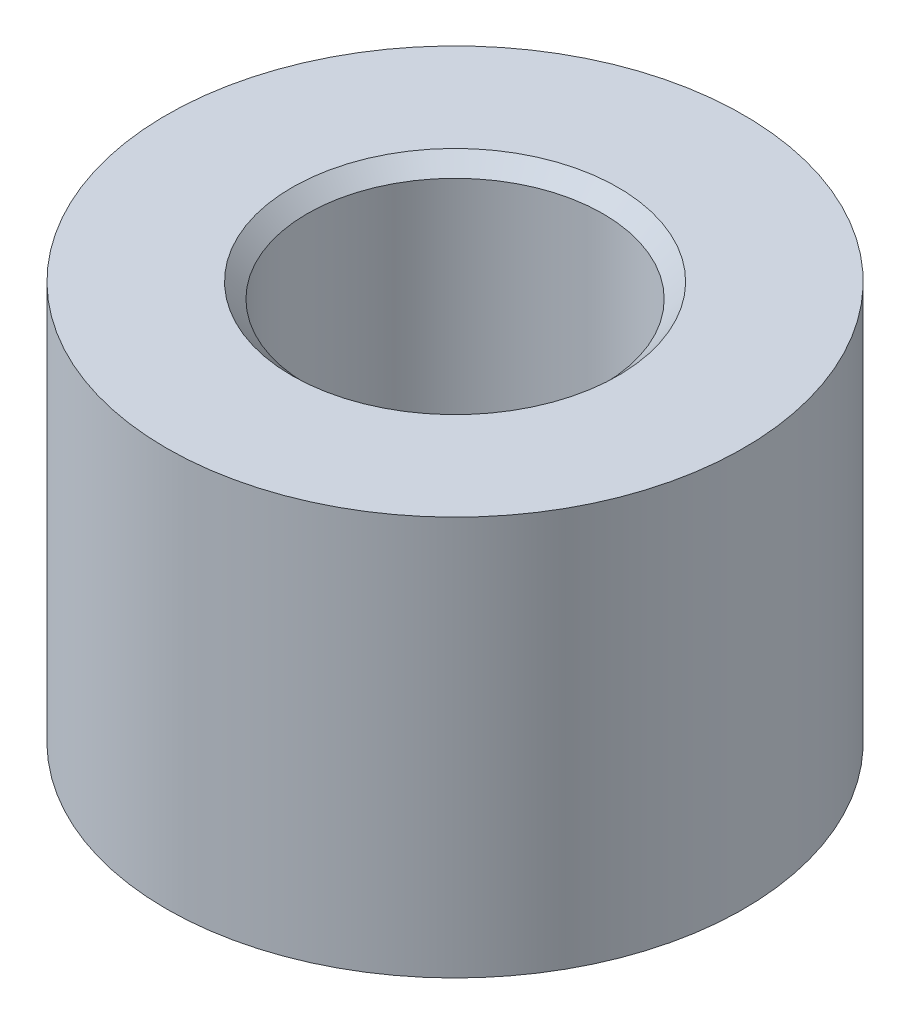
ISO-10303-21;
HEADER;
FILE_DESCRIPTION(('STEP AP214'),'2;1');
FILE_NAME('part.step','',(''),(''),'','','');
FILE_SCHEMA(('AUTOMOTIVE_DESIGN { 1 0 10303 214 1 1 1 1 }'));
ENDSEC;
DATA;
#1=APPLICATION_CONTEXT('core data for automotive mechanical design processes');
#2=APPLICATION_PROTOCOL_DEFINITION('international standard','automotive_design',2000,#1);
#3=PRODUCT_CONTEXT('',#1,'mechanical');
#4=PRODUCT('Part','Part','',(#3));
#5=PRODUCT_RELATED_PRODUCT_CATEGORY('part','',(#4));
#6=PRODUCT_DEFINITION_FORMATION('','',#4);
#7=PRODUCT_DEFINITION_CONTEXT('part definition',#1,'design');
#8=PRODUCT_DEFINITION('design','',#6,#7);
#9=PRODUCT_DEFINITION_SHAPE('','',#8);
#10=(LENGTH_UNIT() NAMED_UNIT(*) SI_UNIT(.MILLI.,.METRE.));
#11=(NAMED_UNIT(*) PLANE_ANGLE_UNIT() SI_UNIT($,.RADIAN.));
#12=(NAMED_UNIT(*) SI_UNIT($,.STERADIAN.) SOLID_ANGLE_UNIT());
#13=UNCERTAINTY_MEASURE_WITH_UNIT(LENGTH_MEASURE(1.E-05),#10,'distance_accuracy_value','');
#14=(GEOMETRIC_REPRESENTATION_CONTEXT(3) GLOBAL_UNCERTAINTY_ASSIGNED_CONTEXT((#13)) GLOBAL_UNIT_ASSIGNED_CONTEXT((#10,
#11,#12)) REPRESENTATION_CONTEXT('',''));
#15=CARTESIAN_POINT('',(0.,0.,0.));
#16=DIRECTION('',(0.,0.,1.));
#17=DIRECTION('',(1.,0.,0.));
#18=AXIS2_PLACEMENT_3D('',#15,#16,#17);
#19=CARTESIAN_POINT('',(0.,5.2690014,0.));
#20=DIRECTION('',(0.,1.,0.));
#21=DIRECTION('',(0.,0.,1.));
#22=AXIS2_PLACEMENT_3D('',#19,#20,#21);
#23=PLANE('',#22);
#24=CARTESIAN_POINT('',(0.,5.2690014,0.));
#25=DIRECTION('',(0.,1.,0.));
#26=DIRECTION('',(0.,0.,1.));
#27=AXIS2_PLACEMENT_3D('',#24,#25,#26);
#28=CIRCLE('',#27,2.1526);
#29=CARTESIAN_POINT('',(0.,5.2690014,2.1526));
#30=VERTEX_POINT('',#29);
#31=EDGE_CURVE('E10',#30,#30,#28,.F.);
#32=ORIENTED_EDGE('',*,*,#31,.T.);
#33=EDGE_LOOP('',(#32));
#34=FACE_BOUND('',#33,.T.);
#35=CARTESIAN_POINT('',(0.,5.2690014,0.));
#36=DIRECTION('',(0.,1.,0.));
#37=DIRECTION('',(0.,0.,1.));
#38=AXIS2_PLACEMENT_3D('',#35,#36,#37);
#39=CIRCLE('',#38,3.81);
#40=CARTESIAN_POINT('',(0.,5.2690014,3.81));
#41=VERTEX_POINT('',#40);
#42=EDGE_CURVE('E51',#41,#41,#39,.T.);
#43=ORIENTED_EDGE('',*,*,#42,.T.);
#44=EDGE_LOOP('',(#43));
#45=FACE_BOUND('',#44,.T.);
#46=ADVANCED_FACE('F31',(#34,#45),#23,.T.);
#47=CARTESIAN_POINT('',(0.,0.,0.));
#48=DIRECTION('',(0.,1.,0.));
#49=DIRECTION('',(0.,0.,1.));
#50=AXIS2_PLACEMENT_3D('',#47,#48,#49);
#51=PLANE('',#50);
#52=CARTESIAN_POINT('',(0.,0.,0.));
#53=DIRECTION('',(0.,1.,0.));
#54=DIRECTION('',(0.,0.,1.));
#55=AXIS2_PLACEMENT_3D('',#52,#53,#54);
#56=CIRCLE('',#55,2.1526);
#57=CARTESIAN_POINT('',(0.,0.,2.1526));
#58=VERTEX_POINT('',#57);
#59=EDGE_CURVE('E46',#58,#58,#56,.T.);
#60=ORIENTED_EDGE('',*,*,#59,.T.);
#61=EDGE_LOOP('',(#60));
#62=FACE_BOUND('',#61,.T.);
#63=CARTESIAN_POINT('',(0.,0.,0.));
#64=DIRECTION('',(0.,1.,0.));
#65=DIRECTION('',(0.,0.,1.));
#66=AXIS2_PLACEMENT_3D('',#63,#64,#65);
#67=CIRCLE('',#66,3.81);
#68=CARTESIAN_POINT('',(0.,0.,3.81));
#69=VERTEX_POINT('',#68);
#70=EDGE_CURVE('E52',#69,#69,#67,.T.);
#71=ORIENTED_EDGE('',*,*,#70,.F.);
#72=EDGE_LOOP('',(#71));
#73=FACE_BOUND('',#72,.T.);
#74=ADVANCED_FACE('F63',(#62,#73),#51,.F.);
#75=CARTESIAN_POINT('',(0.,5.2690014,0.));
#76=DIRECTION('',(0.,-1.,0.));
#77=DIRECTION('',(0.,0.,-1.));
#78=AXIS2_PLACEMENT_3D('',#75,#76,#77);
#79=CYLINDRICAL_SURFACE('',#78,3.81);
#80=ORIENTED_EDGE('',*,*,#42,.F.);
#81=EDGE_LOOP('',(#80));
#82=FACE_BOUND('',#81,.T.);
#83=ORIENTED_EDGE('',*,*,#70,.T.);
#84=EDGE_LOOP('',(#83));
#85=FACE_BOUND('',#84,.T.);
#86=ADVANCED_FACE('F59',(#82,#85),#79,.T.);
#87=CARTESIAN_POINT('',(0.,5.2690014,0.));
#88=DIRECTION('',(0.,-1.,0.));
#89=DIRECTION('',(0.,0.,-1.));
#90=AXIS2_PLACEMENT_3D('',#87,#88,#89);
#91=CYLINDRICAL_SURFACE('',#90,1.9526);
#92=CARTESIAN_POINT('',(0.,0.200000000000001,0.));
#93=DIRECTION('',(0.,1.,0.));
#94=DIRECTION('',(0.,0.,1.));
#95=AXIS2_PLACEMENT_3D('',#92,#93,#94);
#96=CIRCLE('',#95,1.9526);
#97=CARTESIAN_POINT('',(0.,0.200000000000001,1.9526));
#98=VERTEX_POINT('',#97);
#99=EDGE_CURVE('E38',#98,#98,#96,.F.);
#100=ORIENTED_EDGE('',*,*,#99,.T.);
#101=EDGE_LOOP('',(#100));
#102=FACE_BOUND('',#101,.T.);
#103=CARTESIAN_POINT('',(0.,5.0690014,0.));
#104=DIRECTION('',(0.,1.,0.));
#105=DIRECTION('',(0.,0.,1.));
#106=AXIS2_PLACEMENT_3D('',#103,#104,#105);
#107=CIRCLE('',#106,1.9526);
#108=CARTESIAN_POINT('',(0.,5.0690014,1.9526));
#109=VERTEX_POINT('',#108);
#110=EDGE_CURVE('E42',#109,#109,#107,.T.);
#111=ORIENTED_EDGE('',*,*,#110,.T.);
#112=EDGE_LOOP('',(#111));
#113=FACE_BOUND('',#112,.T.);
#114=ADVANCED_FACE('F62',(#102,#113),#91,.F.);
#115=CARTESIAN_POINT('',(0.,0.,0.));
#116=DIRECTION('',(0.,-1.,0.));
#117=DIRECTION('',(0.,0.,-1.));
#118=AXIS2_PLACEMENT_3D('',#115,#116,#117);
#119=CONICAL_SURFACE('',#118,2.1526,0.785398163397447);
#120=ORIENTED_EDGE('',*,*,#99,.F.);
#121=EDGE_LOOP('',(#120));
#122=FACE_BOUND('',#121,.T.);
#123=ORIENTED_EDGE('',*,*,#59,.F.);
#124=EDGE_LOOP('',(#123));
#125=FACE_BOUND('',#124,.T.);
#126=ADVANCED_FACE('F75',(#122,#125),#119,.F.);
#127=CARTESIAN_POINT('',(0.,5.0690014,0.));
#128=DIRECTION('',(0.,1.,0.));
#129=DIRECTION('',(0.,0.,1.));
#130=AXIS2_PLACEMENT_3D('',#127,#128,#129);
#131=CONICAL_SURFACE('',#130,1.9526,0.785398163397452);
#132=ORIENTED_EDGE('',*,*,#31,.F.);
#133=EDGE_LOOP('',(#132));
#134=FACE_BOUND('',#133,.T.);
#135=ORIENTED_EDGE('',*,*,#110,.F.);
#136=EDGE_LOOP('',(#135));
#137=FACE_BOUND('',#136,.T.);
#138=ADVANCED_FACE('F33',(#134,#137),#131,.F.);
#139=CLOSED_SHELL('',(#46,#74,#86,#114,#126,#138));
#140=MANIFOLD_SOLID_BREP('B2',#139);
#141=ADVANCED_BREP_SHAPE_REPRESENTATION('',(#18,#140),#14);
#142=SHAPE_DEFINITION_REPRESENTATION(#9,#141);
ENDSEC;
END-ISO-10303-21;
